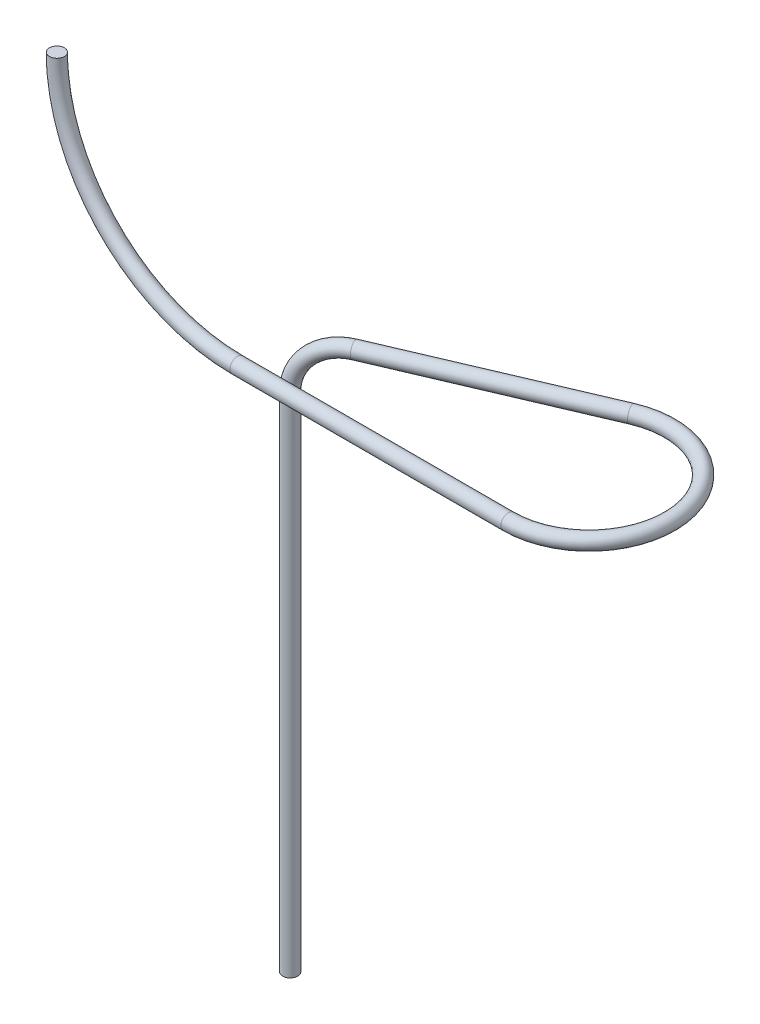
ISO-10303-21;
HEADER;
FILE_DESCRIPTION(('STEP AP214'),'2;1');
FILE_NAME('part.step','',(''),(''),'','','');
FILE_SCHEMA(('AUTOMOTIVE_DESIGN { 1 0 10303 214 1 1 1 1 }'));
ENDSEC;
DATA;
#1=APPLICATION_CONTEXT('core data for automotive mechanical design processes');
#2=APPLICATION_PROTOCOL_DEFINITION('international standard','automotive_design',2000,#1);
#3=PRODUCT_CONTEXT('',#1,'mechanical');
#4=PRODUCT('Part','Part','',(#3));
#5=PRODUCT_RELATED_PRODUCT_CATEGORY('part','',(#4));
#6=PRODUCT_DEFINITION_FORMATION('','',#4);
#7=PRODUCT_DEFINITION_CONTEXT('part definition',#1,'design');
#8=PRODUCT_DEFINITION('design','',#6,#7);
#9=PRODUCT_DEFINITION_SHAPE('','',#8);
#10=(LENGTH_UNIT() NAMED_UNIT(*) SI_UNIT(.MILLI.,.METRE.));
#11=(NAMED_UNIT(*) PLANE_ANGLE_UNIT() SI_UNIT($,.RADIAN.));
#12=(NAMED_UNIT(*) SI_UNIT($,.STERADIAN.) SOLID_ANGLE_UNIT());
#13=UNCERTAINTY_MEASURE_WITH_UNIT(LENGTH_MEASURE(1.E-05),#10,'distance_accuracy_value','');
#14=(GEOMETRIC_REPRESENTATION_CONTEXT(3) GLOBAL_UNCERTAINTY_ASSIGNED_CONTEXT((#13)) GLOBAL_UNIT_ASSIGNED_CONTEXT((#10,
#11,#12)) REPRESENTATION_CONTEXT('',''));
#15=CARTESIAN_POINT('',(0.,0.,0.));
#16=DIRECTION('',(0.,0.,1.));
#17=DIRECTION('',(1.,0.,0.));
#18=AXIS2_PLACEMENT_3D('',#15,#16,#17);
#19=CARTESIAN_POINT('',(-12.,0.,0.));
#20=DIRECTION('',(0.,1.,0.));
#21=DIRECTION('',(0.,0.,-1.));
#22=AXIS2_PLACEMENT_3D('',#19,#20,#21);
#23=PLANE('',#22);
#24=CARTESIAN_POINT('',(-12.,0.,0.));
#25=DIRECTION('',(0.,-1.,0.));
#26=DIRECTION('',(0.,0.,-1.));
#27=AXIS2_PLACEMENT_3D('',#24,#25,#26);
#28=CIRCLE('',#27,0.500000000000001);
#29=CARTESIAN_POINT('',(-12.,0.,-0.500000000000001));
#30=VERTEX_POINT('',#29);
#31=EDGE_CURVE('E51',#30,#30,#28,.T.);
#32=ORIENTED_EDGE('',*,*,#31,.F.);
#33=EDGE_LOOP('',(#32));
#34=FACE_BOUND('',#33,.T.);
#35=ADVANCED_FACE('F39',(#34),#23,.T.);
#36=CARTESIAN_POINT('',(0.,-48.67,-3.5));
#37=DIRECTION('',(0.,1.,0.));
#38=DIRECTION('',(0.392805347159422,0.,0.919621639177203));
#39=AXIS2_PLACEMENT_3D('',#36,#37,#38);
#40=PLANE('',#39);
#41=CARTESIAN_POINT('',(0.,-48.67,-3.5));
#42=DIRECTION('',(0.,-1.,0.));
#43=DIRECTION('',(0.392805347159422,0.,0.919621639177203));
#44=AXIS2_PLACEMENT_3D('',#41,#42,#43);
#45=CIRCLE('',#44,0.500000000000001);
#46=CARTESIAN_POINT('',(0.196402673579717,-48.67,-3.0401891804114));
#47=VERTEX_POINT('',#46);
#48=EDGE_CURVE('E11',#47,#47,#45,.T.);
#49=ORIENTED_EDGE('',*,*,#48,.T.);
#50=EDGE_LOOP('',(#49));
#51=FACE_BOUND('',#50,.T.);
#52=ADVANCED_FACE('F54',(#51),#40,.F.);
#53=CARTESIAN_POINT('',(0.,0.,0.));
#54=DIRECTION('',(0.,0.,-1.));
#55=DIRECTION('',(1.,0.,0.));
#56=AXIS2_PLACEMENT_3D('',#53,#54,#55);
#57=TOROIDAL_SURFACE('',#56,12.,0.500000000000001);
#58=CARTESIAN_POINT('',(0.,-12.,0.));
#59=DIRECTION('',(1.,0.,0.));
#60=DIRECTION('',(0.,0.,-1.));
#61=AXIS2_PLACEMENT_3D('',#58,#59,#60);
#62=CIRCLE('',#61,0.500000000000001);
#63=CARTESIAN_POINT('',(0.,-12.,-0.500000000000001));
#64=VERTEX_POINT('',#63);
#65=EDGE_CURVE('E74',#64,#64,#62,.T.);
#66=ORIENTED_EDGE('',*,*,#65,.F.);
#67=EDGE_LOOP('',(#66));
#68=FACE_BOUND('',#67,.T.);
#69=ORIENTED_EDGE('',*,*,#31,.T.);
#70=EDGE_LOOP('',(#69));
#71=FACE_BOUND('',#70,.T.);
#72=ADVANCED_FACE('F81',(#68,#71),#57,.T.);
#73=CARTESIAN_POINT('',(0.,-12.,0.));
#74=DIRECTION('',(1.,0.,0.));
#75=DIRECTION('',(0.,0.,1.));
#76=AXIS2_PLACEMENT_3D('',#73,#74,#75);
#77=CYLINDRICAL_SURFACE('',#76,0.500000000000001);
#78=CARTESIAN_POINT('',(18.,-12.,0.));
#79=DIRECTION('',(1.,0.,0.));
#80=DIRECTION('',(0.,0.,-1.));
#81=AXIS2_PLACEMENT_3D('',#78,#79,#80);
#82=CIRCLE('',#81,0.500000000000001);
#83=CARTESIAN_POINT('',(18.,-12.,0.5));
#84=VERTEX_POINT('',#83);
#85=EDGE_CURVE('E71',#84,#84,#82,.T.);
#86=ORIENTED_EDGE('',*,*,#85,.F.);
#87=EDGE_LOOP('',(#86));
#88=FACE_BOUND('',#87,.T.);
#89=ORIENTED_EDGE('',*,*,#65,.T.);
#90=EDGE_LOOP('',(#89));
#91=FACE_BOUND('',#90,.T.);
#92=ADVANCED_FACE('F79',(#88,#91),#77,.T.);
#93=CARTESIAN_POINT('',(18.,-12.,-5.36));
#94=DIRECTION('',(0.,-1.,0.));
#95=DIRECTION('',(0.,0.,1.));
#96=AXIS2_PLACEMENT_3D('',#93,#94,#95);
#97=TOROIDAL_SURFACE('',#96,5.36,0.500000000000001);
#98=CARTESIAN_POINT('',(15.8945633392255,-12.,-10.2891719859898));
#99=DIRECTION('',(-0.919621639177203,0.,0.392805347159422));
#100=DIRECTION('',(0.392805347159422,0.,0.919621639177203));
#101=AXIS2_PLACEMENT_3D('',#98,#99,#100);
#102=CIRCLE('',#101,0.500000000000001);
#103=CARTESIAN_POINT('',(15.6981606656458,-12.,-10.7489828055784));
#104=VERTEX_POINT('',#103);
#105=EDGE_CURVE('E66',#104,#104,#102,.T.);
#106=CARTESIAN_POINT('',(18.,-12.,-5.36));
#107=DIRECTION('',(0.,-1.,0.));
#108=DIRECTION('',(0.,0.,1.));
#109=AXIS2_PLACEMENT_3D('',#106,#107,#108);
#110=CIRCLE('',#109,5.86);
#111=EDGE_CURVE('',#104,#84,#110,.T.);
#112=ORIENTED_EDGE('',*,*,#105,.F.);
#113=ORIENTED_EDGE('',*,*,#85,.T.);
#114=ORIENTED_EDGE('',*,*,#111,.T.);
#115=ORIENTED_EDGE('',*,*,#111,.F.);
#116=EDGE_LOOP('',(#112,#114,#113,#115));
#117=FACE_BOUND('',#116,.T.);
#118=ADVANCED_FACE('F88',(#117),#97,.T.);
#119=CARTESIAN_POINT('',(15.8945633392255,-12.,-10.2891719859898));
#120=DIRECTION('',(-0.919621639177203,0.,0.392805347159422));
#121=DIRECTION('',(-0.392805347159422,0.,-0.919621639177203));
#122=AXIS2_PLACEMENT_3D('',#119,#120,#121);
#123=CYLINDRICAL_SURFACE('',#122,0.500000000000001);
#124=CARTESIAN_POINT('',(2.9887703273259,-12.,-4.77661737826812));
#125=DIRECTION('',(-0.919621639177203,0.,0.392805347159422));
#126=DIRECTION('',(0.392805347159422,0.,0.919621639177203));
#127=AXIS2_PLACEMENT_3D('',#124,#125,#126);
#128=CIRCLE('',#127,0.500000000000001);
#129=CARTESIAN_POINT('',(2.9887703273259,-11.5,-4.77661737826812));
#130=VERTEX_POINT('',#129);
#131=EDGE_CURVE('E64',#130,#130,#128,.T.);
#132=ORIENTED_EDGE('',*,*,#131,.F.);
#133=EDGE_LOOP('',(#132));
#134=FACE_BOUND('',#133,.T.);
#135=ORIENTED_EDGE('',*,*,#105,.T.);
#136=EDGE_LOOP('',(#135));
#137=FACE_BOUND('',#136,.T.);
#138=ADVANCED_FACE('F118',(#134,#137),#123,.T.);
#139=CARTESIAN_POINT('',(2.98877032732591,-15.25,-4.77661737826812));
#140=DIRECTION('',(-0.392805347159422,0.,-0.919621639177203));
#141=DIRECTION('',(0.919621639177203,0.,-0.392805347159422));
#142=AXIS2_PLACEMENT_3D('',#139,#140,#141);
#143=TOROIDAL_SURFACE('',#142,3.25,0.500000000000001);
#144=CARTESIAN_POINT('',(0.,-15.25,-3.5));
#145=DIRECTION('',(0.,-1.,0.));
#146=DIRECTION('',(0.392805347159422,0.,0.919621639177203));
#147=AXIS2_PLACEMENT_3D('',#144,#145,#146);
#148=CIRCLE('',#147,0.500000000000001);
#149=CARTESIAN_POINT('',(-0.459810819588601,-15.25,-3.30359732642029));
#150=VERTEX_POINT('',#149);
#151=EDGE_CURVE('E46',#150,#150,#148,.T.);
#152=CARTESIAN_POINT('',(2.98877032732591,-15.25,-4.77661737826812));
#153=DIRECTION('',(-0.392805347159422,0.,-0.919621639177203));
#154=DIRECTION('',(0.919621639177203,0.,-0.392805347159422));
#155=AXIS2_PLACEMENT_3D('',#152,#153,#154);
#156=CIRCLE('',#155,3.75);
#157=EDGE_CURVE('',#150,#130,#156,.T.);
#158=ORIENTED_EDGE('',*,*,#151,.F.);
#159=ORIENTED_EDGE('',*,*,#131,.T.);
#160=ORIENTED_EDGE('',*,*,#157,.T.);
#161=ORIENTED_EDGE('',*,*,#157,.F.);
#162=EDGE_LOOP('',(#158,#160,#159,#161));
#163=FACE_BOUND('',#162,.T.);
#164=ADVANCED_FACE('F59',(#163),#143,.T.);
#165=CARTESIAN_POINT('',(0.,-15.25,-3.5));
#166=DIRECTION('',(0.,-1.,0.));
#167=DIRECTION('',(1.,0.,0.));
#168=AXIS2_PLACEMENT_3D('',#165,#166,#167);
#169=CYLINDRICAL_SURFACE('',#168,0.500000000000001);
#170=ORIENTED_EDGE('',*,*,#48,.F.);
#171=EDGE_LOOP('',(#170));
#172=FACE_BOUND('',#171,.T.);
#173=ORIENTED_EDGE('',*,*,#151,.T.);
#174=EDGE_LOOP('',(#173));
#175=FACE_BOUND('',#174,.T.);
#176=ADVANCED_FACE('F56',(#172,#175),#169,.T.);
#177=CLOSED_SHELL('',(#35,#52,#72,#92,#118,#138,#164,#176));
#178=MANIFOLD_SOLID_BREP('B2',#177);
#179=ADVANCED_BREP_SHAPE_REPRESENTATION('',(#18,#178),#14);
#180=SHAPE_DEFINITION_REPRESENTATION(#9,#179);
ENDSEC;
END-ISO-10303-21;
